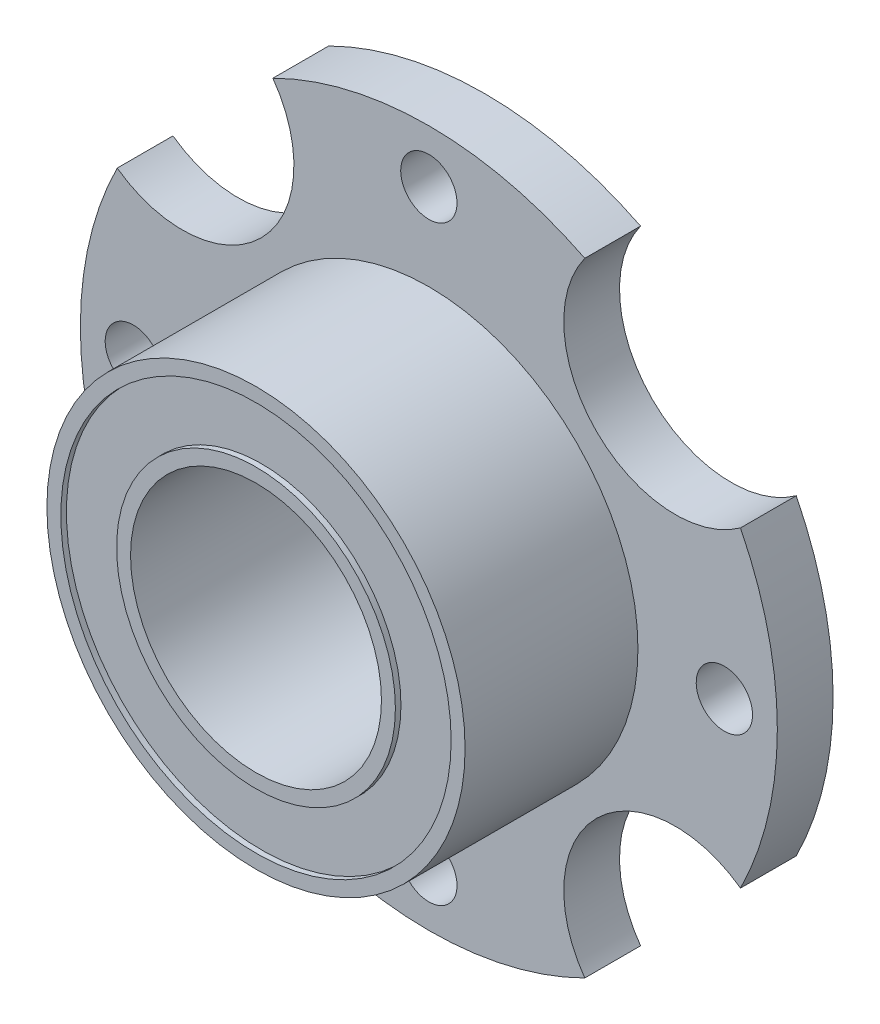
ISO-10303-21;
HEADER;
FILE_DESCRIPTION(('STEP AP214'),'2;1');
FILE_NAME('part.step','',(''),(''),'','','');
FILE_SCHEMA(('AUTOMOTIVE_DESIGN { 1 0 10303 214 1 1 1 1 }'));
ENDSEC;
DATA;
#1=APPLICATION_CONTEXT('core data for automotive mechanical design processes');
#2=APPLICATION_PROTOCOL_DEFINITION('international standard','automotive_design',2000,#1);
#3=PRODUCT_CONTEXT('',#1,'mechanical');
#4=PRODUCT('Part','Part','',(#3));
#5=PRODUCT_RELATED_PRODUCT_CATEGORY('part','',(#4));
#6=PRODUCT_DEFINITION_FORMATION('','',#4);
#7=PRODUCT_DEFINITION_CONTEXT('part definition',#1,'design');
#8=PRODUCT_DEFINITION('design','',#6,#7);
#9=PRODUCT_DEFINITION_SHAPE('','',#8);
#10=(LENGTH_UNIT() NAMED_UNIT(*) SI_UNIT(.MILLI.,.METRE.));
#11=(NAMED_UNIT(*) PLANE_ANGLE_UNIT() SI_UNIT($,.RADIAN.));
#12=(NAMED_UNIT(*) SI_UNIT($,.STERADIAN.) SOLID_ANGLE_UNIT());
#13=UNCERTAINTY_MEASURE_WITH_UNIT(LENGTH_MEASURE(1.E-05),#10,'distance_accuracy_value','');
#14=(GEOMETRIC_REPRESENTATION_CONTEXT(3) GLOBAL_UNCERTAINTY_ASSIGNED_CONTEXT((#13)) GLOBAL_UNIT_ASSIGNED_CONTEXT((#10,
#11,#12)) REPRESENTATION_CONTEXT('',''));
#15=CARTESIAN_POINT('',(0.,0.,0.));
#16=DIRECTION('',(0.,0.,1.));
#17=DIRECTION('',(1.,0.,0.));
#18=AXIS2_PLACEMENT_3D('',#15,#16,#17);
#19=CARTESIAN_POINT('',(0.,0.,10.));
#20=DIRECTION('',(0.,0.,-1.));
#21=DIRECTION('',(-1.,0.,0.));
#22=AXIS2_PLACEMENT_3D('',#19,#20,#21);
#23=CYLINDRICAL_SURFACE('',#22,62.5);
#24=CARTESIAN_POINT('',(0.,0.,0.));
#25=DIRECTION('',(0.,0.,1.));
#26=DIRECTION('',(1.,0.,0.));
#27=AXIS2_PLACEMENT_3D('',#24,#25,#26);
#28=CIRCLE('',#27,62.5);
#29=CARTESIAN_POINT('',(-55.8913748176546,27.9714894310697,0.));
#30=VERTEX_POINT('',#29);
#31=CARTESIAN_POINT('',(-55.8913748176544,-27.9714894310701,0.));
#32=VERTEX_POINT('',#31);
#33=EDGE_CURVE('E202',#30,#32,#28,.T.);
#34=ORIENTED_EDGE('',*,*,#33,.T.);
#35=DIRECTION('',(0.,0.,-1.));
#36=VECTOR('',#35,1.);
#37=CARTESIAN_POINT('',(-55.8913748176544,-27.9714894310701,10.));
#38=LINE('',#37,#36);
#39=CARTESIAN_POINT('',(-55.8913748176544,-27.9714894310701,10.));
#40=VERTEX_POINT('',#39);
#41=EDGE_CURVE('E117',#40,#32,#38,.T.);
#42=ORIENTED_EDGE('',*,*,#41,.F.);
#43=CARTESIAN_POINT('',(0.,0.,10.));
#44=DIRECTION('',(0.,0.,1.));
#45=DIRECTION('',(1.,0.,0.));
#46=AXIS2_PLACEMENT_3D('',#43,#44,#45);
#47=CIRCLE('',#46,62.5);
#48=CARTESIAN_POINT('',(-55.8913748176546,27.9714894310697,10.));
#49=VERTEX_POINT('',#48);
#50=EDGE_CURVE('E120',#49,#40,#47,.T.);
#51=ORIENTED_EDGE('',*,*,#50,.F.);
#52=DIRECTION('',(0.,0.,-1.));
#53=VECTOR('',#52,1.);
#54=CARTESIAN_POINT('',(-55.8913748176546,27.9714894310697,10.));
#55=LINE('',#54,#53);
#56=EDGE_CURVE('E206',#49,#30,#55,.T.);
#57=ORIENTED_EDGE('',*,*,#56,.T.);
#58=EDGE_LOOP('',(#34,#42,#51,#57));
#59=FACE_BOUND('',#58,.T.);
#60=ADVANCED_FACE('F40',(#59),#23,.T.);
#61=CARTESIAN_POINT('',(-53.,-5.55145532876058E-13,10.));
#62=DIRECTION('',(0.,0.,-1.));
#63=DIRECTION('',(0.,1.,0.));
#64=AXIS2_PLACEMENT_3D('',#61,#62,#63);
#65=CYLINDRICAL_SURFACE('',#64,5.05);
#66=CARTESIAN_POINT('',(-53.,-5.55145532876058E-13,10.));
#67=DIRECTION('',(0.,0.,1.));
#68=DIRECTION('',(0.,-1.,0.));
#69=AXIS2_PLACEMENT_3D('',#66,#67,#68);
#70=CIRCLE('',#69,5.05);
#71=CARTESIAN_POINT('',(-52.9999999999999,-5.05000000000055,10.));
#72=VERTEX_POINT('',#71);
#73=EDGE_CURVE('E48',#72,#72,#70,.T.);
#74=ORIENTED_EDGE('',*,*,#73,.T.);
#75=EDGE_LOOP('',(#74));
#76=FACE_BOUND('',#75,.T.);
#77=CARTESIAN_POINT('',(-53.,-5.55145532876058E-13,0.));
#78=DIRECTION('',(0.,0.,1.));
#79=DIRECTION('',(0.,-1.,0.));
#80=AXIS2_PLACEMENT_3D('',#77,#78,#79);
#81=CIRCLE('',#80,5.05);
#82=CARTESIAN_POINT('',(-52.9999999999999,-5.05000000000055,0.));
#83=VERTEX_POINT('',#82);
#84=EDGE_CURVE('E11',#83,#83,#81,.T.);
#85=ORIENTED_EDGE('',*,*,#84,.F.);
#86=EDGE_LOOP('',(#85));
#87=FACE_BOUND('',#86,.T.);
#88=ADVANCED_FACE('F42',(#76,#87),#65,.F.);
#89=CARTESIAN_POINT('',(-44.1941738241596,44.1941738241588,10.));
#90=DIRECTION('',(0.,0.,-1.));
#91=DIRECTION('',(0.,1.,0.));
#92=AXIS2_PLACEMENT_3D('',#89,#90,#91);
#93=CYLINDRICAL_SURFACE('',#92,20.);
#94=CARTESIAN_POINT('',(-44.1941738241596,44.1941738241588,0.));
#95=DIRECTION('',(0.,0.,-1.));
#96=DIRECTION('',(0.,-1.,0.));
#97=AXIS2_PLACEMENT_3D('',#94,#95,#96);
#98=CIRCLE('',#97,20.);
#99=CARTESIAN_POINT('',(-27.9714894310706,55.8913748176541,0.));
#100=VERTEX_POINT('',#99);
#101=EDGE_CURVE('E203',#100,#30,#98,.T.);
#102=ORIENTED_EDGE('',*,*,#101,.T.);
#103=ORIENTED_EDGE('',*,*,#56,.F.);
#104=CARTESIAN_POINT('',(-44.1941738241596,44.1941738241588,10.));
#105=DIRECTION('',(0.,0.,-1.));
#106=DIRECTION('',(0.,-1.,0.));
#107=AXIS2_PLACEMENT_3D('',#104,#105,#106);
#108=CIRCLE('',#107,20.);
#109=CARTESIAN_POINT('',(-27.9714894310706,55.8913748176541,10.));
#110=VERTEX_POINT('',#109);
#111=EDGE_CURVE('E209',#110,#49,#108,.T.);
#112=ORIENTED_EDGE('',*,*,#111,.F.);
#113=DIRECTION('',(0.,0.,-1.));
#114=VECTOR('',#113,1.);
#115=CARTESIAN_POINT('',(-27.9714894310706,55.8913748176541,10.));
#116=LINE('',#115,#114);
#117=EDGE_CURVE('E211',#110,#100,#116,.T.);
#118=ORIENTED_EDGE('',*,*,#117,.T.);
#119=EDGE_LOOP('',(#102,#103,#112,#118));
#120=FACE_BOUND('',#119,.T.);
#121=ADVANCED_FACE('F264',(#120),#93,.F.);
#122=CARTESIAN_POINT('',(27.9714894310703,55.8913748176543,0.));
#123=VERTEX_POINT('',#122);
#124=EDGE_CURVE('E55',#123,#100,#28,.T.);
#125=ORIENTED_EDGE('',*,*,#124,.T.);
#126=ORIENTED_EDGE('',*,*,#117,.F.);
#127=CARTESIAN_POINT('',(27.9714894310703,55.8913748176543,10.));
#128=VERTEX_POINT('',#127);
#129=EDGE_CURVE('E63',#128,#110,#47,.T.);
#130=ORIENTED_EDGE('',*,*,#129,.F.);
#131=DIRECTION('',(0.,0.,-1.));
#132=VECTOR('',#131,1.);
#133=CARTESIAN_POINT('',(27.9714894310703,55.8913748176543,10.));
#134=LINE('',#133,#132);
#135=EDGE_CURVE('E189',#128,#123,#134,.T.);
#136=ORIENTED_EDGE('',*,*,#135,.T.);
#137=EDGE_LOOP('',(#125,#126,#130,#136));
#138=FACE_BOUND('',#137,.T.);
#139=ADVANCED_FACE('F250',(#138),#23,.T.);
#140=CARTESIAN_POINT('',(0.,53.,10.));
#141=DIRECTION('',(0.,0.,-1.));
#142=DIRECTION('',(1.,0.,0.));
#143=AXIS2_PLACEMENT_3D('',#140,#141,#142);
#144=CYLINDRICAL_SURFACE('',#143,5.05);
#145=CARTESIAN_POINT('',(0.,53.,10.));
#146=DIRECTION('',(0.,0.,1.));
#147=DIRECTION('',(-1.,0.,0.));
#148=AXIS2_PLACEMENT_3D('',#145,#146,#147);
#149=CIRCLE('',#148,5.05);
#150=CARTESIAN_POINT('',(-5.05,53.,10.));
#151=VERTEX_POINT('',#150);
#152=EDGE_CURVE('E196',#151,#151,#149,.T.);
#153=ORIENTED_EDGE('',*,*,#152,.T.);
#154=EDGE_LOOP('',(#153));
#155=FACE_BOUND('',#154,.T.);
#156=CARTESIAN_POINT('',(0.,53.,0.));
#157=DIRECTION('',(0.,0.,1.));
#158=DIRECTION('',(-1.,0.,0.));
#159=AXIS2_PLACEMENT_3D('',#156,#157,#158);
#160=CIRCLE('',#159,5.05);
#161=CARTESIAN_POINT('',(-5.05,53.,0.));
#162=VERTEX_POINT('',#161);
#163=EDGE_CURVE('E199',#162,#162,#160,.T.);
#164=ORIENTED_EDGE('',*,*,#163,.F.);
#165=EDGE_LOOP('',(#164));
#166=FACE_BOUND('',#165,.T.);
#167=ADVANCED_FACE('F258',(#155,#166),#144,.F.);
#168=CARTESIAN_POINT('',(44.1941738241593,44.1941738241591,10.));
#169=DIRECTION('',(0.,0.,-1.));
#170=DIRECTION('',(1.,0.,0.));
#171=AXIS2_PLACEMENT_3D('',#168,#169,#170);
#172=CYLINDRICAL_SURFACE('',#171,20.);
#173=CARTESIAN_POINT('',(44.1941738241593,44.1941738241591,0.));
#174=DIRECTION('',(0.,0.,-1.));
#175=DIRECTION('',(-1.,0.,0.));
#176=AXIS2_PLACEMENT_3D('',#173,#174,#175);
#177=CIRCLE('',#176,20.);
#178=CARTESIAN_POINT('',(55.8913748176544,27.9714894310701,0.));
#179=VERTEX_POINT('',#178);
#180=EDGE_CURVE('E186',#179,#123,#177,.T.);
#181=ORIENTED_EDGE('',*,*,#180,.T.);
#182=ORIENTED_EDGE('',*,*,#135,.F.);
#183=CARTESIAN_POINT('',(44.1941738241593,44.1941738241591,10.));
#184=DIRECTION('',(0.,0.,-1.));
#185=DIRECTION('',(-1.,0.,0.));
#186=AXIS2_PLACEMENT_3D('',#183,#184,#185);
#187=CIRCLE('',#186,20.);
#188=CARTESIAN_POINT('',(55.8913748176544,27.9714894310701,10.));
#189=VERTEX_POINT('',#188);
#190=EDGE_CURVE('E191',#189,#128,#187,.T.);
#191=ORIENTED_EDGE('',*,*,#190,.F.);
#192=DIRECTION('',(0.,0.,-1.));
#193=VECTOR('',#192,1.);
#194=CARTESIAN_POINT('',(55.8913748176544,27.9714894310701,10.));
#195=LINE('',#194,#193);
#196=EDGE_CURVE('E193',#189,#179,#195,.T.);
#197=ORIENTED_EDGE('',*,*,#196,.T.);
#198=EDGE_LOOP('',(#181,#182,#191,#197));
#199=FACE_BOUND('',#198,.T.);
#200=ADVANCED_FACE('F245',(#199),#172,.F.);
#201=CARTESIAN_POINT('',(55.8913748176544,-27.9714894310701,0.));
#202=VERTEX_POINT('',#201);
#203=EDGE_CURVE('E170',#202,#179,#28,.T.);
#204=ORIENTED_EDGE('',*,*,#203,.T.);
#205=ORIENTED_EDGE('',*,*,#196,.F.);
#206=CARTESIAN_POINT('',(55.8913748176544,-27.9714894310701,10.));
#207=VERTEX_POINT('',#206);
#208=EDGE_CURVE('E121',#207,#189,#47,.T.);
#209=ORIENTED_EDGE('',*,*,#208,.F.);
#210=DIRECTION('',(0.,0.,-1.));
#211=VECTOR('',#210,1.);
#212=CARTESIAN_POINT('',(55.8913748176544,-27.9714894310701,10.));
#213=LINE('',#212,#211);
#214=EDGE_CURVE('E174',#207,#202,#213,.T.);
#215=ORIENTED_EDGE('',*,*,#214,.T.);
#216=EDGE_LOOP('',(#204,#205,#209,#215));
#217=FACE_BOUND('',#216,.T.);
#218=ADVANCED_FACE('F246',(#217),#23,.T.);
#219=CARTESIAN_POINT('',(53.,1.85048510958686E-13,10.));
#220=DIRECTION('',(0.,0.,-1.));
#221=DIRECTION('',(0.,-1.,0.));
#222=AXIS2_PLACEMENT_3D('',#219,#220,#221);
#223=CYLINDRICAL_SURFACE('',#222,5.05);
#224=CARTESIAN_POINT('',(53.,1.85048510958686E-13,10.));
#225=DIRECTION('',(0.,0.,1.));
#226=DIRECTION('',(0.,1.,0.));
#227=AXIS2_PLACEMENT_3D('',#224,#225,#226);
#228=CIRCLE('',#227,5.05);
#229=CARTESIAN_POINT('',(53.,5.05000000000018,10.));
#230=VERTEX_POINT('',#229);
#231=EDGE_CURVE('E180',#230,#230,#228,.T.);
#232=ORIENTED_EDGE('',*,*,#231,.T.);
#233=EDGE_LOOP('',(#232));
#234=FACE_BOUND('',#233,.T.);
#235=CARTESIAN_POINT('',(53.,1.85048510958686E-13,0.));
#236=DIRECTION('',(0.,0.,1.));
#237=DIRECTION('',(0.,1.,0.));
#238=AXIS2_PLACEMENT_3D('',#235,#236,#237);
#239=CIRCLE('',#238,5.05);
#240=CARTESIAN_POINT('',(53.,5.05000000000018,0.));
#241=VERTEX_POINT('',#240);
#242=EDGE_CURVE('E183',#241,#241,#239,.T.);
#243=ORIENTED_EDGE('',*,*,#242,.F.);
#244=EDGE_LOOP('',(#243));
#245=FACE_BOUND('',#244,.T.);
#246=ADVANCED_FACE('F248',(#234,#245),#223,.F.);
#247=CARTESIAN_POINT('',(44.1941738241593,-44.1941738241591,10.));
#248=DIRECTION('',(0.,0.,-1.));
#249=DIRECTION('',(0.,-1.,0.));
#250=AXIS2_PLACEMENT_3D('',#247,#248,#249);
#251=CYLINDRICAL_SURFACE('',#250,20.);
#252=CARTESIAN_POINT('',(44.1941738241593,-44.1941738241591,0.));
#253=DIRECTION('',(0.,0.,-1.));
#254=DIRECTION('',(0.,1.,0.));
#255=AXIS2_PLACEMENT_3D('',#252,#253,#254);
#256=CIRCLE('',#255,20.);
#257=CARTESIAN_POINT('',(27.9714894310702,-55.8913748176543,0.));
#258=VERTEX_POINT('',#257);
#259=EDGE_CURVE('E171',#258,#202,#256,.T.);
#260=ORIENTED_EDGE('',*,*,#259,.T.);
#261=ORIENTED_EDGE('',*,*,#214,.F.);
#262=CARTESIAN_POINT('',(44.1941738241593,-44.1941738241591,10.));
#263=DIRECTION('',(0.,0.,-1.));
#264=DIRECTION('',(0.,1.,0.));
#265=AXIS2_PLACEMENT_3D('',#262,#263,#264);
#266=CIRCLE('',#265,20.);
#267=CARTESIAN_POINT('',(27.9714894310702,-55.8913748176543,10.));
#268=VERTEX_POINT('',#267);
#269=EDGE_CURVE('E177',#268,#207,#266,.T.);
#270=ORIENTED_EDGE('',*,*,#269,.F.);
#271=DIRECTION('',(0.,0.,-1.));
#272=VECTOR('',#271,1.);
#273=CARTESIAN_POINT('',(27.9714894310702,-55.8913748176543,10.));
#274=LINE('',#273,#272);
#275=EDGE_CURVE('E114',#268,#258,#274,.T.);
#276=ORIENTED_EDGE('',*,*,#275,.T.);
#277=EDGE_LOOP('',(#260,#261,#270,#276));
#278=FACE_BOUND('',#277,.T.);
#279=ADVANCED_FACE('F255',(#278),#251,.F.);
#280=CARTESIAN_POINT('',(0.,0.,0.));
#281=DIRECTION('',(0.,0.,1.));
#282=DIRECTION('',(1.,0.,0.));
#283=AXIS2_PLACEMENT_3D('',#280,#281,#282);
#284=PLANE('',#283);
#285=CARTESIAN_POINT('',(0.,0.,0.));
#286=DIRECTION('',(0.,0.,1.));
#287=DIRECTION('',(1.,0.,0.));
#288=AXIS2_PLACEMENT_3D('',#285,#286,#287);
#289=CIRCLE('',#288,22.5);
#290=CARTESIAN_POINT('',(22.5,0.,0.));
#291=VERTEX_POINT('',#290);
#292=EDGE_CURVE('E159',#291,#291,#289,.T.);
#293=ORIENTED_EDGE('',*,*,#292,.T.);
#294=EDGE_LOOP('',(#293));
#295=FACE_BOUND('',#294,.T.);
#296=CARTESIAN_POINT('',(0.,0.,0.));
#297=DIRECTION('',(0.,0.,1.));
#298=DIRECTION('',(1.,0.,0.));
#299=AXIS2_PLACEMENT_3D('',#296,#297,#298);
#300=CIRCLE('',#299,25.);
#301=CARTESIAN_POINT('',(25.,0.,0.));
#302=VERTEX_POINT('',#301);
#303=EDGE_CURVE('E133',#302,#302,#300,.T.);
#304=ORIENTED_EDGE('',*,*,#303,.F.);
#305=EDGE_LOOP('',(#304));
#306=FACE_BOUND('',#305,.T.);
#307=ADVANCED_FACE('F276',(#295,#306),#284,.F.);
#308=CARTESIAN_POINT('',(0.,0.,41.));
#309=DIRECTION('',(0.,0.,1.));
#310=DIRECTION('',(1.,0.,0.));
#311=AXIS2_PLACEMENT_3D('',#308,#309,#310);
#312=PLANE('',#311);
#313=CARTESIAN_POINT('',(0.,0.,41.));
#314=DIRECTION('',(0.,0.,1.));
#315=DIRECTION('',(1.,0.,0.));
#316=AXIS2_PLACEMENT_3D('',#313,#314,#315);
#317=CIRCLE('',#316,22.5);
#318=CARTESIAN_POINT('',(22.5,0.,41.));
#319=VERTEX_POINT('',#318);
#320=EDGE_CURVE('E162',#319,#319,#317,.T.);
#321=ORIENTED_EDGE('',*,*,#320,.F.);
#322=EDGE_LOOP('',(#321));
#323=FACE_BOUND('',#322,.T.);
#324=CARTESIAN_POINT('',(0.,0.,41.));
#325=DIRECTION('',(0.,0.,1.));
#326=DIRECTION('',(1.,0.,0.));
#327=AXIS2_PLACEMENT_3D('',#324,#325,#326);
#328=CIRCLE('',#327,25.);
#329=CARTESIAN_POINT('',(25.,0.,41.));
#330=VERTEX_POINT('',#329);
#331=EDGE_CURVE('E147',#330,#330,#328,.T.);
#332=ORIENTED_EDGE('',*,*,#331,.T.);
#333=EDGE_LOOP('',(#332));
#334=FACE_BOUND('',#333,.T.);
#335=ADVANCED_FACE('F281',(#323,#334),#312,.T.);
#336=CARTESIAN_POINT('',(0.,0.,41.));
#337=DIRECTION('',(0.,0.,1.));
#338=DIRECTION('',(1.,0.,0.));
#339=AXIS2_PLACEMENT_3D('',#336,#337,#338);
#340=CIRCLE('',#339,35.);
#341=CARTESIAN_POINT('',(35.,0.,41.));
#342=VERTEX_POINT('',#341);
#343=EDGE_CURVE('E153',#342,#342,#340,.T.);
#344=ORIENTED_EDGE('',*,*,#343,.F.);
#345=EDGE_LOOP('',(#344));
#346=FACE_BOUND('',#345,.T.);
#347=CARTESIAN_POINT('',(0.,0.,41.));
#348=DIRECTION('',(0.,0.,1.));
#349=DIRECTION('',(1.,0.,0.));
#350=AXIS2_PLACEMENT_3D('',#347,#348,#349);
#351=CIRCLE('',#350,37.5);
#352=CARTESIAN_POINT('',(37.5,0.,41.));
#353=VERTEX_POINT('',#352);
#354=EDGE_CURVE('E165',#353,#353,#351,.T.);
#355=ORIENTED_EDGE('',*,*,#354,.T.);
#356=EDGE_LOOP('',(#355));
#357=FACE_BOUND('',#356,.T.);
#358=ADVANCED_FACE('F331',(#346,#357),#312,.T.);
#359=ORIENTED_EDGE('',*,*,#84,.T.);
#360=EDGE_LOOP('',(#359));
#361=FACE_BOUND('',#360,.T.);
#362=ORIENTED_EDGE('',*,*,#163,.T.);
#363=EDGE_LOOP('',(#362));
#364=FACE_BOUND('',#363,.T.);
#365=ORIENTED_EDGE('',*,*,#242,.T.);
#366=EDGE_LOOP('',(#365));
#367=FACE_BOUND('',#366,.T.);
#368=CARTESIAN_POINT('',(0.,0.,0.));
#369=DIRECTION('',(0.,0.,1.));
#370=DIRECTION('',(1.,0.,0.));
#371=AXIS2_PLACEMENT_3D('',#368,#369,#370);
#372=CIRCLE('',#371,35.);
#373=CARTESIAN_POINT('',(35.,0.,0.));
#374=VERTEX_POINT('',#373);
#375=EDGE_CURVE('E142',#374,#374,#372,.T.);
#376=ORIENTED_EDGE('',*,*,#375,.T.);
#377=EDGE_LOOP('',(#376));
#378=FACE_BOUND('',#377,.T.);
#379=ORIENTED_EDGE('',*,*,#124,.F.);
#380=ORIENTED_EDGE('',*,*,#180,.F.);
#381=ORIENTED_EDGE('',*,*,#203,.F.);
#382=ORIENTED_EDGE('',*,*,#259,.F.);
#383=CARTESIAN_POINT('',(-27.9714894310703,-55.8913748176543,0.));
#384=VERTEX_POINT('',#383);
#385=EDGE_CURVE('E128',#384,#258,#28,.T.);
#386=ORIENTED_EDGE('',*,*,#385,.F.);
#387=CARTESIAN_POINT('',(-44.1941738241593,-44.1941738241591,0.));
#388=DIRECTION('',(0.,0.,-1.));
#389=DIRECTION('',(1.,0.,0.));
#390=AXIS2_PLACEMENT_3D('',#387,#388,#389);
#391=CIRCLE('',#390,20.);
#392=EDGE_CURVE('E132',#32,#384,#391,.T.);
#393=ORIENTED_EDGE('',*,*,#392,.F.);
#394=ORIENTED_EDGE('',*,*,#33,.F.);
#395=ORIENTED_EDGE('',*,*,#101,.F.);
#396=EDGE_LOOP('',(#379,#380,#381,#382,#386,#393,#394,#395));
#397=FACE_BOUND('',#396,.T.);
#398=CARTESIAN_POINT('',(0.,-53.,0.));
#399=DIRECTION('',(0.,0.,1.));
#400=DIRECTION('',(1.,0.,0.));
#401=AXIS2_PLACEMENT_3D('',#398,#399,#400);
#402=CIRCLE('',#401,5.05);
#403=CARTESIAN_POINT('',(5.05,-53.,0.));
#404=VERTEX_POINT('',#403);
#405=EDGE_CURVE('E230',#404,#404,#402,.T.);
#406=ORIENTED_EDGE('',*,*,#405,.T.);
#407=EDGE_LOOP('',(#406));
#408=FACE_BOUND('',#407,.T.);
#409=ADVANCED_FACE('F272',(#361,#364,#367,#378,#397,#408),#284,.F.);
#410=CARTESIAN_POINT('',(0.,0.,41.));
#411=DIRECTION('',(0.,0.,-1.));
#412=DIRECTION('',(-1.,0.,0.));
#413=AXIS2_PLACEMENT_3D('',#410,#411,#412);
#414=CYLINDRICAL_SURFACE('',#413,37.5);
#415=CARTESIAN_POINT('',(0.,0.,10.));
#416=DIRECTION('',(0.,0.,1.));
#417=DIRECTION('',(1.,0.,0.));
#418=AXIS2_PLACEMENT_3D('',#415,#416,#417);
#419=CIRCLE('',#418,37.5);
#420=CARTESIAN_POINT('',(37.5,0.,10.));
#421=VERTEX_POINT('',#420);
#422=EDGE_CURVE('E234',#421,#421,#419,.T.);
#423=ORIENTED_EDGE('',*,*,#422,.T.);
#424=EDGE_LOOP('',(#423));
#425=FACE_BOUND('',#424,.T.);
#426=ORIENTED_EDGE('',*,*,#354,.F.);
#427=EDGE_LOOP('',(#426));
#428=FACE_BOUND('',#427,.T.);
#429=ADVANCED_FACE('F285',(#425,#428),#414,.T.);
#430=CARTESIAN_POINT('',(0.,0.,41.));
#431=DIRECTION('',(0.,0.,-1.));
#432=DIRECTION('',(-1.,0.,0.));
#433=AXIS2_PLACEMENT_3D('',#430,#431,#432);
#434=CYLINDRICAL_SURFACE('',#433,22.5);
#435=ORIENTED_EDGE('',*,*,#320,.T.);
#436=EDGE_LOOP('',(#435));
#437=FACE_BOUND('',#436,.T.);
#438=ORIENTED_EDGE('',*,*,#292,.F.);
#439=EDGE_LOOP('',(#438));
#440=FACE_BOUND('',#439,.T.);
#441=ADVANCED_FACE('F384',(#437,#440),#434,.F.);
#442=CARTESIAN_POINT('',(0.,0.,40.));
#443=DIRECTION('',(0.,0.,1.));
#444=DIRECTION('',(1.,0.,0.));
#445=AXIS2_PLACEMENT_3D('',#442,#443,#444);
#446=CYLINDRICAL_SURFACE('',#445,35.);
#447=CARTESIAN_POINT('',(0.,0.,40.));
#448=DIRECTION('',(0.,0.,1.));
#449=DIRECTION('',(1.,0.,0.));
#450=AXIS2_PLACEMENT_3D('',#447,#448,#449);
#451=CIRCLE('',#450,35.);
#452=CARTESIAN_POINT('',(35.,0.,40.));
#453=VERTEX_POINT('',#452);
#454=EDGE_CURVE('E156',#453,#453,#451,.T.);
#455=ORIENTED_EDGE('',*,*,#454,.F.);
#456=EDGE_LOOP('',(#455));
#457=FACE_BOUND('',#456,.T.);
#458=ORIENTED_EDGE('',*,*,#343,.T.);
#459=EDGE_LOOP('',(#458));
#460=FACE_BOUND('',#459,.T.);
#461=ADVANCED_FACE('F440',(#457,#460),#446,.F.);
#462=CARTESIAN_POINT('',(0.,0.,40.));
#463=DIRECTION('',(0.,0.,1.));
#464=DIRECTION('',(1.,0.,0.));
#465=AXIS2_PLACEMENT_3D('',#462,#463,#464);
#466=PLANE('',#465);
#467=CARTESIAN_POINT('',(0.,0.,40.));
#468=DIRECTION('',(0.,0.,1.));
#469=DIRECTION('',(1.,0.,0.));
#470=AXIS2_PLACEMENT_3D('',#467,#468,#469);
#471=CIRCLE('',#470,25.);
#472=CARTESIAN_POINT('',(25.,0.,40.));
#473=VERTEX_POINT('',#472);
#474=EDGE_CURVE('E150',#473,#473,#471,.T.);
#475=ORIENTED_EDGE('',*,*,#474,.F.);
#476=EDGE_LOOP('',(#475));
#477=FACE_BOUND('',#476,.T.);
#478=ORIENTED_EDGE('',*,*,#454,.T.);
#479=EDGE_LOOP('',(#478));
#480=FACE_BOUND('',#479,.T.);
#481=ADVANCED_FACE('F430',(#477,#480),#466,.T.);
#482=CARTESIAN_POINT('',(0.,0.,40.));
#483=DIRECTION('',(0.,0.,1.));
#484=DIRECTION('',(1.,0.,0.));
#485=AXIS2_PLACEMENT_3D('',#482,#483,#484);
#486=CYLINDRICAL_SURFACE('',#485,25.);
#487=ORIENTED_EDGE('',*,*,#474,.T.);
#488=EDGE_LOOP('',(#487));
#489=FACE_BOUND('',#488,.T.);
#490=ORIENTED_EDGE('',*,*,#331,.F.);
#491=EDGE_LOOP('',(#490));
#492=FACE_BOUND('',#491,.T.);
#493=ADVANCED_FACE('F413',(#489,#492),#486,.T.);
#494=CARTESIAN_POINT('',(0.,0.,1.));
#495=DIRECTION('',(0.,0.,-1.));
#496=DIRECTION('',(1.,0.,0.));
#497=AXIS2_PLACEMENT_3D('',#494,#495,#496);
#498=PLANE('',#497);
#499=CARTESIAN_POINT('',(0.,0.,1.));
#500=DIRECTION('',(0.,0.,1.));
#501=DIRECTION('',(1.,0.,0.));
#502=AXIS2_PLACEMENT_3D('',#499,#500,#501);
#503=CIRCLE('',#502,35.);
#504=CARTESIAN_POINT('',(35.,0.,1.));
#505=VERTEX_POINT('',#504);
#506=EDGE_CURVE('E144',#505,#505,#503,.T.);
#507=ORIENTED_EDGE('',*,*,#506,.F.);
#508=EDGE_LOOP('',(#507));
#509=FACE_BOUND('',#508,.T.);
#510=CARTESIAN_POINT('',(0.,0.,1.));
#511=DIRECTION('',(0.,0.,1.));
#512=DIRECTION('',(1.,0.,0.));
#513=AXIS2_PLACEMENT_3D('',#510,#511,#512);
#514=CIRCLE('',#513,25.);
#515=CARTESIAN_POINT('',(25.,0.,1.));
#516=VERTEX_POINT('',#515);
#517=EDGE_CURVE('E136',#516,#516,#514,.T.);
#518=ORIENTED_EDGE('',*,*,#517,.T.);
#519=EDGE_LOOP('',(#518));
#520=FACE_BOUND('',#519,.T.);
#521=ADVANCED_FACE('F403',(#509,#520),#498,.T.);
#522=CARTESIAN_POINT('',(0.,0.,1.));
#523=DIRECTION('',(0.,0.,-1.));
#524=DIRECTION('',(-1.,0.,0.));
#525=AXIS2_PLACEMENT_3D('',#522,#523,#524);
#526=CYLINDRICAL_SURFACE('',#525,35.);
#527=ORIENTED_EDGE('',*,*,#506,.T.);
#528=EDGE_LOOP('',(#527));
#529=FACE_BOUND('',#528,.T.);
#530=ORIENTED_EDGE('',*,*,#375,.F.);
#531=EDGE_LOOP('',(#530));
#532=FACE_BOUND('',#531,.T.);
#533=ADVANCED_FACE('F393',(#529,#532),#526,.F.);
#534=CARTESIAN_POINT('',(0.,0.,1.));
#535=DIRECTION('',(0.,0.,-1.));
#536=DIRECTION('',(-1.,0.,0.));
#537=AXIS2_PLACEMENT_3D('',#534,#535,#536);
#538=CYLINDRICAL_SURFACE('',#537,25.);
#539=ORIENTED_EDGE('',*,*,#517,.F.);
#540=EDGE_LOOP('',(#539));
#541=FACE_BOUND('',#540,.T.);
#542=ORIENTED_EDGE('',*,*,#303,.T.);
#543=EDGE_LOOP('',(#542));
#544=FACE_BOUND('',#543,.T.);
#545=ADVANCED_FACE('F220',(#541,#544),#538,.T.);
#546=CARTESIAN_POINT('',(-22.0970869120796,-22.0970869120796,10.));
#547=DIRECTION('',(0.,0.,1.));
#548=DIRECTION('',(1.,0.,0.));
#549=AXIS2_PLACEMENT_3D('',#546,#547,#548);
#550=PLANE('',#549);
#551=ORIENTED_EDGE('',*,*,#73,.F.);
#552=EDGE_LOOP('',(#551));
#553=FACE_BOUND('',#552,.T.);
#554=ORIENTED_EDGE('',*,*,#152,.F.);
#555=EDGE_LOOP('',(#554));
#556=FACE_BOUND('',#555,.T.);
#557=ORIENTED_EDGE('',*,*,#231,.F.);
#558=EDGE_LOOP('',(#557));
#559=FACE_BOUND('',#558,.T.);
#560=CARTESIAN_POINT('',(0.,-53.,10.));
#561=DIRECTION('',(0.,0.,1.));
#562=DIRECTION('',(1.,0.,0.));
#563=AXIS2_PLACEMENT_3D('',#560,#561,#562);
#564=CIRCLE('',#563,5.05);
#565=CARTESIAN_POINT('',(5.05,-53.,10.));
#566=VERTEX_POINT('',#565);
#567=EDGE_CURVE('E228',#566,#566,#564,.T.);
#568=ORIENTED_EDGE('',*,*,#567,.F.);
#569=EDGE_LOOP('',(#568));
#570=FACE_BOUND('',#569,.T.);
#571=ORIENTED_EDGE('',*,*,#129,.T.);
#572=ORIENTED_EDGE('',*,*,#111,.T.);
#573=ORIENTED_EDGE('',*,*,#50,.T.);
#574=CARTESIAN_POINT('',(-44.1941738241593,-44.1941738241591,10.));
#575=DIRECTION('',(0.,0.,-1.));
#576=DIRECTION('',(1.,0.,0.));
#577=AXIS2_PLACEMENT_3D('',#574,#575,#576);
#578=CIRCLE('',#577,20.);
#579=CARTESIAN_POINT('',(-27.9714894310703,-55.8913748176543,10.));
#580=VERTEX_POINT('',#579);
#581=EDGE_CURVE('E118',#40,#580,#578,.T.);
#582=ORIENTED_EDGE('',*,*,#581,.T.);
#583=EDGE_CURVE('E107',#580,#268,#47,.T.);
#584=ORIENTED_EDGE('',*,*,#583,.T.);
#585=ORIENTED_EDGE('',*,*,#269,.T.);
#586=ORIENTED_EDGE('',*,*,#208,.T.);
#587=ORIENTED_EDGE('',*,*,#190,.T.);
#588=EDGE_LOOP('',(#571,#572,#573,#582,#584,#585,#586,#587));
#589=FACE_BOUND('',#588,.T.);
#590=ORIENTED_EDGE('',*,*,#422,.F.);
#591=EDGE_LOOP('',(#590));
#592=FACE_BOUND('',#591,.T.);
#593=ADVANCED_FACE('F123',(#553,#556,#559,#570,#589,#592),#550,.T.);
#594=CARTESIAN_POINT('',(-44.1941738241593,-44.1941738241591,10.));
#595=DIRECTION('',(0.,0.,-1.));
#596=DIRECTION('',(-1.,0.,0.));
#597=AXIS2_PLACEMENT_3D('',#594,#595,#596);
#598=CYLINDRICAL_SURFACE('',#597,20.);
#599=ORIENTED_EDGE('',*,*,#392,.T.);
#600=DIRECTION('',(0.,0.,-1.));
#601=VECTOR('',#600,1.);
#602=CARTESIAN_POINT('',(-27.9714894310703,-55.8913748176543,10.));
#603=LINE('',#602,#601);
#604=EDGE_CURVE('E111',#580,#384,#603,.T.);
#605=ORIENTED_EDGE('',*,*,#604,.F.);
#606=ORIENTED_EDGE('',*,*,#581,.F.);
#607=ORIENTED_EDGE('',*,*,#41,.T.);
#608=EDGE_LOOP('',(#599,#605,#606,#607));
#609=FACE_BOUND('',#608,.T.);
#610=ADVANCED_FACE('F130',(#609),#598,.F.);
#611=ORIENTED_EDGE('',*,*,#385,.T.);
#612=ORIENTED_EDGE('',*,*,#275,.F.);
#613=ORIENTED_EDGE('',*,*,#583,.F.);
#614=ORIENTED_EDGE('',*,*,#604,.T.);
#615=EDGE_LOOP('',(#611,#612,#613,#614));
#616=FACE_BOUND('',#615,.T.);
#617=ADVANCED_FACE('F109',(#616),#23,.T.);
#618=CARTESIAN_POINT('',(0.,-53.,10.));
#619=DIRECTION('',(0.,0.,-1.));
#620=DIRECTION('',(-1.,0.,0.));
#621=AXIS2_PLACEMENT_3D('',#618,#619,#620);
#622=CYLINDRICAL_SURFACE('',#621,5.05);
#623=ORIENTED_EDGE('',*,*,#567,.T.);
#624=EDGE_LOOP('',(#623));
#625=FACE_BOUND('',#624,.T.);
#626=ORIENTED_EDGE('',*,*,#405,.F.);
#627=EDGE_LOOP('',(#626));
#628=FACE_BOUND('',#627,.T.);
#629=ADVANCED_FACE('F262',(#625,#628),#622,.F.);
#630=CLOSED_SHELL('',(#60,#88,#121,#139,#167,#200,#218,#246,#279,#307,#335,#358,#409,#429,#441,
#461,#481,#493,#521,#533,#545,#593,#610,#617,#629));
#631=MANIFOLD_SOLID_BREP('B2',#630);
#632=ADVANCED_BREP_SHAPE_REPRESENTATION('',(#18,#631),#14);
#633=SHAPE_DEFINITION_REPRESENTATION(#9,#632);
ENDSEC;
END-ISO-10303-21;
